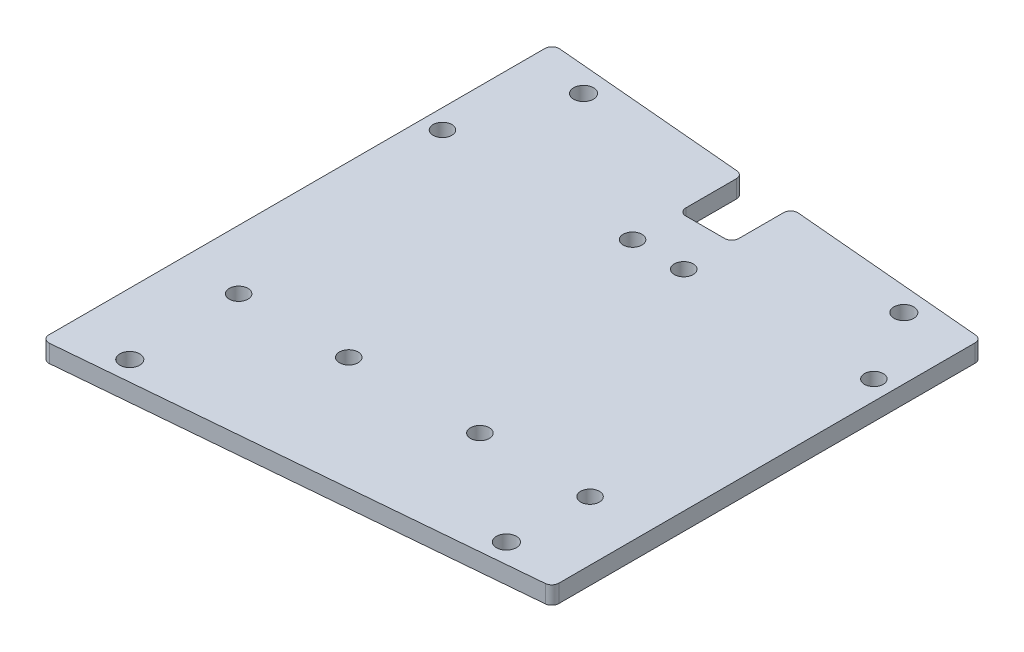
ISO-10303-21;
HEADER;
FILE_DESCRIPTION(('STEP AP214'),'2;1');
FILE_NAME('part.step','',(''),(''),'','','');
FILE_SCHEMA(('AUTOMOTIVE_DESIGN { 1 0 10303 214 1 1 1 1 }'));
ENDSEC;
DATA;
#1=APPLICATION_CONTEXT('core data for automotive mechanical design processes');
#2=APPLICATION_PROTOCOL_DEFINITION('international standard','automotive_design',2000,#1);
#3=PRODUCT_CONTEXT('',#1,'mechanical');
#4=PRODUCT('Part','Part','',(#3));
#5=PRODUCT_RELATED_PRODUCT_CATEGORY('part','',(#4));
#6=PRODUCT_DEFINITION_FORMATION('','',#4);
#7=PRODUCT_DEFINITION_CONTEXT('part definition',#1,'design');
#8=PRODUCT_DEFINITION('design','',#6,#7);
#9=PRODUCT_DEFINITION_SHAPE('','',#8);
#10=(LENGTH_UNIT() NAMED_UNIT(*) SI_UNIT(.MILLI.,.METRE.));
#11=(NAMED_UNIT(*) PLANE_ANGLE_UNIT() SI_UNIT($,.RADIAN.));
#12=(NAMED_UNIT(*) SI_UNIT($,.STERADIAN.) SOLID_ANGLE_UNIT());
#13=UNCERTAINTY_MEASURE_WITH_UNIT(LENGTH_MEASURE(1.E-05),#10,'distance_accuracy_value','');
#14=(GEOMETRIC_REPRESENTATION_CONTEXT(3) GLOBAL_UNCERTAINTY_ASSIGNED_CONTEXT((#13)) GLOBAL_UNIT_ASSIGNED_CONTEXT((#10,
#11,#12)) REPRESENTATION_CONTEXT('',''));
#15=CARTESIAN_POINT('',(0.,0.,0.));
#16=DIRECTION('',(0.,0.,1.));
#17=DIRECTION('',(1.,0.,0.));
#18=AXIS2_PLACEMENT_3D('',#15,#16,#17);
#19=CARTESIAN_POINT('',(0.,6.35,-76.835));
#20=DIRECTION('',(-0.0871557427476541,0.,0.996194698091746));
#21=DIRECTION('',(0.996194698091746,0.,0.0871557427476541));
#22=AXIS2_PLACEMENT_3D('',#19,#20,#21);
#23=PLANE('',#22);
#24=DIRECTION('',(-0.996194698091746,0.,-0.0871557427476541));
#25=VECTOR('',#24,1.);
#26=CARTESIAN_POINT('',(0.,6.35,-76.835));
#27=LINE('',#26,#25);
#28=CARTESIAN_POINT('',(-99.4736244134209,6.35,-85.5378144560095));
#29=VERTEX_POINT('',#28);
#30=CARTESIAN_POINT('',(-169.323624413421,6.35,-91.648897603295));
#31=VERTEX_POINT('',#30);
#32=EDGE_CURVE('E174',#29,#31,#27,.T.);
#33=ORIENTED_EDGE('',*,*,#32,.F.);
#34=DIRECTION('',(0.,-1.,0.));
#35=VECTOR('',#34,1.);
#36=CARTESIAN_POINT('',(-99.473624413421,6.35,-85.5378144560095));
#37=LINE('',#36,#35);
#38=CARTESIAN_POINT('',(-99.4736244134209,0.,-85.5378144560095));
#39=VERTEX_POINT('',#38);
#40=EDGE_CURVE('E158',#29,#39,#37,.T.);
#41=ORIENTED_EDGE('',*,*,#40,.T.);
#42=DIRECTION('',(-0.996194698091746,0.,-0.0871557427476541));
#43=VECTOR('',#42,1.);
#44=CARTESIAN_POINT('',(0.,0.,-76.835));
#45=LINE('',#44,#43);
#46=CARTESIAN_POINT('',(-169.323624413421,0.,-91.648897603295));
#47=VERTEX_POINT('',#46);
#48=EDGE_CURVE('E171',#39,#47,#45,.T.);
#49=ORIENTED_EDGE('',*,*,#48,.T.);
#50=DIRECTION('',(0.,1.,0.));
#51=VECTOR('',#50,1.);
#52=CARTESIAN_POINT('',(-169.323624413421,6.35,-91.648897603295));
#53=LINE('',#52,#51);
#54=EDGE_CURVE('E176',#47,#31,#53,.T.);
#55=ORIENTED_EDGE('',*,*,#54,.T.);
#56=EDGE_LOOP('',(#33,#41,#49,#55));
#57=FACE_BOUND('',#56,.T.);
#58=ADVANCED_FACE('F41',(#57),#23,.F.);
#59=CARTESIAN_POINT('',(-5.49362441342097,0.,-77.3156298578436));
#60=VERTEX_POINT('',#59);
#61=CARTESIAN_POINT('',(-75.343624413421,0.,-83.4267130051291));
#62=VERTEX_POINT('',#61);
#63=EDGE_CURVE('E181',#60,#62,#45,.T.);
#64=ORIENTED_EDGE('',*,*,#63,.T.);
#65=DIRECTION('',(0.,1.,0.));
#66=VECTOR('',#65,1.);
#67=CARTESIAN_POINT('',(-75.343624413421,6.35,-83.4267130051291));
#68=LINE('',#67,#66);
#69=CARTESIAN_POINT('',(-75.343624413421,6.35,-83.4267130051291));
#70=VERTEX_POINT('',#69);
#71=EDGE_CURVE('E224',#62,#70,#68,.T.);
#72=ORIENTED_EDGE('',*,*,#71,.T.);
#73=CARTESIAN_POINT('',(-5.49362441342097,6.35,-77.3156298578436));
#74=VERTEX_POINT('',#73);
#75=EDGE_CURVE('E278',#74,#70,#27,.T.);
#76=ORIENTED_EDGE('',*,*,#75,.F.);
#77=DIRECTION('',(0.,1.,0.));
#78=VECTOR('',#77,1.);
#79=CARTESIAN_POINT('',(-5.49362441342097,6.35,-77.3156298578436));
#80=LINE('',#79,#78);
#81=EDGE_CURVE('E222',#74,#60,#80,.F.);
#82=ORIENTED_EDGE('',*,*,#81,.T.);
#83=EDGE_LOOP('',(#64,#72,#76,#82));
#84=FACE_BOUND('',#83,.T.);
#85=ADVANCED_FACE('F303',(#84),#23,.F.);
#86=CARTESIAN_POINT('',(0.,6.35,76.835));
#87=DIRECTION('',(-0.0871557427476544,0.,-0.996194698091746));
#88=DIRECTION('',(-0.996194698091746,0.,0.0871557427476544));
#89=AXIS2_PLACEMENT_3D('',#86,#87,#88);
#90=PLANE('',#89);
#91=DIRECTION('',(0.996194698091746,0.,-0.0871557427476544));
#92=VECTOR('',#91,1.);
#93=CARTESIAN_POINT('',(0.,0.,76.835));
#94=LINE('',#93,#92);
#95=CARTESIAN_POINT('',(-169.323624413421,0.,91.6488976032951));
#96=VERTEX_POINT('',#95);
#97=CARTESIAN_POINT('',(-5.49362441342094,0.,77.3156298578436));
#98=VERTEX_POINT('',#97);
#99=EDGE_CURVE('E185',#96,#98,#94,.T.);
#100=ORIENTED_EDGE('',*,*,#99,.T.);
#101=DIRECTION('',(0.,1.,0.));
#102=VECTOR('',#101,1.);
#103=CARTESIAN_POINT('',(-5.49362441342094,6.35,77.3156298578436));
#104=LINE('',#103,#102);
#105=CARTESIAN_POINT('',(-5.49362441342094,6.35,77.3156298578436));
#106=VERTEX_POINT('',#105);
#107=EDGE_CURVE('E244',#98,#106,#104,.T.);
#108=ORIENTED_EDGE('',*,*,#107,.T.);
#109=DIRECTION('',(0.996194698091746,0.,-0.0871557427476544));
#110=VECTOR('',#109,1.);
#111=CARTESIAN_POINT('',(0.,6.35,76.835));
#112=LINE('',#111,#110);
#113=CARTESIAN_POINT('',(-169.323624413421,6.35,91.6488976032951));
#114=VERTEX_POINT('',#113);
#115=EDGE_CURVE('E191',#114,#106,#112,.T.);
#116=ORIENTED_EDGE('',*,*,#115,.F.);
#117=DIRECTION('',(0.,-1.,0.));
#118=VECTOR('',#117,1.);
#119=CARTESIAN_POINT('',(-169.323624413421,6.35,91.6488976032951));
#120=LINE('',#119,#118);
#121=EDGE_CURVE('E241',#114,#96,#120,.T.);
#122=ORIENTED_EDGE('',*,*,#121,.T.);
#123=EDGE_LOOP('',(#100,#108,#116,#122));
#124=FACE_BOUND('',#123,.T.);
#125=ADVANCED_FACE('F309',(#124),#90,.F.);
#126=CARTESIAN_POINT('',(0.,6.35,0.));
#127=DIRECTION('',(0.,1.,0.));
#128=DIRECTION('',(0.,0.,1.));
#129=AXIS2_PLACEMENT_3D('',#126,#127,#128);
#130=PLANE('',#129);
#131=DIRECTION('',(0.,0.,1.));
#132=VECTOR('',#131,1.);
#133=CARTESIAN_POINT('',(-97.155,6.35,-62.2766315847764));
#134=LINE('',#133,#132);
#135=CARTESIAN_POINT('',(-97.155,6.35,-83.0074799228565));
#136=VERTEX_POINT('',#135);
#137=CARTESIAN_POINT('',(-97.155,6.35,-64.8166315847764));
#138=VERTEX_POINT('',#137);
#139=EDGE_CURVE('E257',#136,#138,#134,.T.);
#140=ORIENTED_EDGE('',*,*,#139,.F.);
#141=CARTESIAN_POINT('',(-99.695,6.35,-83.0074799228565));
#142=DIRECTION('',(0.,1.,0.));
#143=DIRECTION('',(0.,0.,1.));
#144=AXIS2_PLACEMENT_3D('',#141,#142,#143);
#145=CIRCLE('',#144,2.54);
#146=EDGE_CURVE('E220',#136,#29,#145,.T.);
#147=ORIENTED_EDGE('',*,*,#146,.T.);
#148=ORIENTED_EDGE('',*,*,#32,.T.);
#149=CARTESIAN_POINT('',(-169.545,6.35,-89.118563070142));
#150=DIRECTION('',(0.,1.,0.));
#151=DIRECTION('',(0.,0.,1.));
#152=AXIS2_PLACEMENT_3D('',#149,#150,#151);
#153=CIRCLE('',#152,2.54);
#154=CARTESIAN_POINT('',(-172.085,6.35,-89.118563070142));
#155=VERTEX_POINT('',#154);
#156=EDGE_CURVE('E210',#31,#155,#153,.T.);
#157=ORIENTED_EDGE('',*,*,#156,.T.);
#158=DIRECTION('',(0.,0.,-1.));
#159=VECTOR('',#158,1.);
#160=CARTESIAN_POINT('',(-172.085,6.35,-92.1682631695527));
#161=LINE('',#160,#159);
#162=CARTESIAN_POINT('',(-172.085,6.35,89.1185630701421));
#163=VERTEX_POINT('',#162);
#164=EDGE_CURVE('E284',#163,#155,#161,.T.);
#165=ORIENTED_EDGE('',*,*,#164,.F.);
#166=CARTESIAN_POINT('',(-169.545,6.35,89.118563070142));
#167=DIRECTION('',(0.,1.,0.));
#168=DIRECTION('',(0.,0.,1.));
#169=AXIS2_PLACEMENT_3D('',#166,#167,#168);
#170=CIRCLE('',#169,2.54);
#171=EDGE_CURVE('E212',#163,#114,#170,.T.);
#172=ORIENTED_EDGE('',*,*,#171,.T.);
#173=ORIENTED_EDGE('',*,*,#115,.T.);
#174=CARTESIAN_POINT('',(-5.71499999999998,6.35,74.7852953246905));
#175=DIRECTION('',(0.,1.,0.));
#176=DIRECTION('',(0.,0.,1.));
#177=AXIS2_PLACEMENT_3D('',#174,#175,#176);
#178=CIRCLE('',#177,2.54);
#179=CARTESIAN_POINT('',(-3.17499999999998,6.35,74.7852953246905));
#180=VERTEX_POINT('',#179);
#181=EDGE_CURVE('E214',#106,#180,#178,.T.);
#182=ORIENTED_EDGE('',*,*,#181,.T.);
#183=DIRECTION('',(0.,0.,1.));
#184=VECTOR('',#183,1.);
#185=CARTESIAN_POINT('',(-3.17500000000001,6.35,-77.1127765066948));
#186=LINE('',#185,#184);
#187=CARTESIAN_POINT('',(-3.17500000000001,6.35,-74.7852953246905));
#188=VERTEX_POINT('',#187);
#189=EDGE_CURVE('E345',#188,#180,#186,.T.);
#190=ORIENTED_EDGE('',*,*,#189,.F.);
#191=CARTESIAN_POINT('',(-5.71500000000001,6.35,-74.7852953246905));
#192=DIRECTION('',(0.,1.,0.));
#193=DIRECTION('',(0.,0.,1.));
#194=AXIS2_PLACEMENT_3D('',#191,#192,#193);
#195=CIRCLE('',#194,2.54);
#196=EDGE_CURVE('E216',#188,#74,#195,.T.);
#197=ORIENTED_EDGE('',*,*,#196,.T.);
#198=ORIENTED_EDGE('',*,*,#75,.T.);
#199=CARTESIAN_POINT('',(-75.565,6.35,-80.896378471976));
#200=DIRECTION('',(0.,1.,0.));
#201=DIRECTION('',(0.,0.,1.));
#202=AXIS2_PLACEMENT_3D('',#199,#200,#201);
#203=CIRCLE('',#202,2.54);
#204=CARTESIAN_POINT('',(-78.105,6.35,-80.896378471976));
#205=VERTEX_POINT('',#204);
#206=EDGE_CURVE('E218',#70,#205,#203,.T.);
#207=ORIENTED_EDGE('',*,*,#206,.T.);
#208=DIRECTION('',(0.,0.,-1.));
#209=VECTOR('',#208,1.);
#210=CARTESIAN_POINT('',(-78.105,6.35,-62.2766315847764));
#211=LINE('',#210,#209);
#212=CARTESIAN_POINT('',(-78.105,6.35,-64.8166315847764));
#213=VERTEX_POINT('',#212);
#214=EDGE_CURVE('E271',#213,#205,#211,.T.);
#215=ORIENTED_EDGE('',*,*,#214,.F.);
#216=CARTESIAN_POINT('',(-80.645,6.35,-64.8166315847764));
#217=DIRECTION('',(0.,1.,0.));
#218=DIRECTION('',(0.,0.,1.));
#219=AXIS2_PLACEMENT_3D('',#216,#217,#218);
#220=CIRCLE('',#219,2.54);
#221=CARTESIAN_POINT('',(-80.645,6.35,-62.2766315847764));
#222=VERTEX_POINT('',#221);
#223=EDGE_CURVE('E56',#213,#222,#220,.F.);
#224=ORIENTED_EDGE('',*,*,#223,.T.);
#225=DIRECTION('',(1.,0.,0.));
#226=VECTOR('',#225,1.);
#227=CARTESIAN_POINT('',(-78.105,6.35,-62.2766315847764));
#228=LINE('',#227,#226);
#229=CARTESIAN_POINT('',(-94.615,6.35,-62.2766315847764));
#230=VERTEX_POINT('',#229);
#231=EDGE_CURVE('E258',#230,#222,#228,.T.);
#232=ORIENTED_EDGE('',*,*,#231,.F.);
#233=CARTESIAN_POINT('',(-94.615,6.35,-64.8166315847764));
#234=DIRECTION('',(0.,1.,0.));
#235=DIRECTION('',(0.,0.,1.));
#236=AXIS2_PLACEMENT_3D('',#233,#234,#235);
#237=CIRCLE('',#236,2.54);
#238=EDGE_CURVE('E49',#230,#138,#237,.F.);
#239=ORIENTED_EDGE('',*,*,#238,.T.);
#240=EDGE_LOOP('',(#140,#147,#148,#157,#165,#172,#173,#182,#190,#197,#198,#207,#215,#224,#232,#239));
#241=FACE_BOUND('',#240,.T.);
#242=CARTESIAN_POINT('',(-25.3999999999999,6.35,-71.4003706478002));
#243=DIRECTION('',(0.,1.,0.));
#244=DIRECTION('',(0.,0.,1.));
#245=AXIS2_PLACEMENT_3D('',#242,#243,#244);
#246=CIRCLE('',#245,3.57124);
#247=CARTESIAN_POINT('',(-25.3999999999999,6.35,-67.8291306478002));
#248=VERTEX_POINT('',#247);
#249=EDGE_CURVE('E292',#248,#248,#246,.T.);
#250=ORIENTED_EDGE('',*,*,#249,.F.);
#251=EDGE_LOOP('',(#250));
#252=FACE_BOUND('',#251,.T.);
#253=CARTESIAN_POINT('',(-25.3999999999999,6.35,71.4003706478001));
#254=DIRECTION('',(0.,1.,0.));
#255=DIRECTION('',(0.,0.,1.));
#256=AXIS2_PLACEMENT_3D('',#253,#254,#255);
#257=CIRCLE('',#256,3.57124);
#258=CARTESIAN_POINT('',(-25.3999999999999,6.35,74.9716106478001));
#259=VERTEX_POINT('',#258);
#260=EDGE_CURVE('E357',#259,#259,#257,.T.);
#261=ORIENTED_EDGE('',*,*,#260,.F.);
#262=EDGE_LOOP('',(#261));
#263=FACE_BOUND('',#262,.T.);
#264=CARTESIAN_POINT('',(-149.86,6.35,82.2892097102357));
#265=DIRECTION('',(0.,1.,0.));
#266=DIRECTION('',(0.,0.,1.));
#267=AXIS2_PLACEMENT_3D('',#264,#265,#266);
#268=CIRCLE('',#267,3.57124);
#269=CARTESIAN_POINT('',(-149.86,6.35,85.8604497102357));
#270=VERTEX_POINT('',#269);
#271=EDGE_CURVE('E363',#270,#270,#268,.T.);
#272=ORIENTED_EDGE('',*,*,#271,.F.);
#273=EDGE_LOOP('',(#272));
#274=FACE_BOUND('',#273,.T.);
#275=CARTESIAN_POINT('',(-151.13,6.35,-82.0419999999999));
#276=DIRECTION('',(0.,1.,0.));
#277=DIRECTION('',(0.,0.,1.));
#278=AXIS2_PLACEMENT_3D('',#275,#276,#277);
#279=CIRCLE('',#278,3.57124);
#280=CARTESIAN_POINT('',(-151.13,6.35,-78.4707599999999));
#281=VERTEX_POINT('',#280);
#282=EDGE_CURVE('E369',#281,#281,#279,.T.);
#283=ORIENTED_EDGE('',*,*,#282,.F.);
#284=EDGE_LOOP('',(#283));
#285=FACE_BOUND('',#284,.T.);
#286=CARTESIAN_POINT('',(-24.4850000000002,6.35,42.2700000000001));
#287=DIRECTION('',(0.,1.,0.));
#288=DIRECTION('',(0.,0.,1.));
#289=AXIS2_PLACEMENT_3D('',#286,#287,#288);
#290=CIRCLE('',#289,3.373501);
#291=CARTESIAN_POINT('',(-24.4850000000002,6.35,45.6435010000001));
#292=VERTEX_POINT('',#291);
#293=EDGE_CURVE('E375',#292,#292,#290,.T.);
#294=ORIENTED_EDGE('',*,*,#293,.F.);
#295=EDGE_LOOP('',(#294));
#296=FACE_BOUND('',#295,.T.);
#297=CARTESIAN_POINT('',(-64.0721000000002,6.35,42.2700000000001));
#298=DIRECTION('',(0.,1.,0.));
#299=DIRECTION('',(0.,0.,1.));
#300=AXIS2_PLACEMENT_3D('',#297,#298,#299);
#301=CIRCLE('',#300,3.373501);
#302=CARTESIAN_POINT('',(-64.0721000000002,6.35,45.6435010000001));
#303=VERTEX_POINT('',#302);
#304=EDGE_CURVE('E381',#303,#303,#301,.T.);
#305=ORIENTED_EDGE('',*,*,#304,.F.);
#306=EDGE_LOOP('',(#305));
#307=FACE_BOUND('',#306,.T.);
#308=CARTESIAN_POINT('',(-111.1879,6.35,42.2700000000001));
#309=DIRECTION('',(0.,1.,0.));
#310=DIRECTION('',(0.,0.,1.));
#311=AXIS2_PLACEMENT_3D('',#308,#309,#310);
#312=CIRCLE('',#311,3.373501);
#313=CARTESIAN_POINT('',(-111.1879,6.35,45.6435010000001));
#314=VERTEX_POINT('',#313);
#315=EDGE_CURVE('E387',#314,#314,#312,.T.);
#316=ORIENTED_EDGE('',*,*,#315,.F.);
#317=EDGE_LOOP('',(#316));
#318=FACE_BOUND('',#317,.T.);
#319=CARTESIAN_POINT('',(-150.775,6.35,42.2700000000001));
#320=DIRECTION('',(0.,1.,0.));
#321=DIRECTION('',(0.,0.,1.));
#322=AXIS2_PLACEMENT_3D('',#319,#320,#321);
#323=CIRCLE('',#322,3.373501);
#324=CARTESIAN_POINT('',(-150.775,6.35,45.6435010000001));
#325=VERTEX_POINT('',#324);
#326=EDGE_CURVE('E393',#325,#325,#323,.T.);
#327=ORIENTED_EDGE('',*,*,#326,.F.);
#328=EDGE_LOOP('',(#327));
#329=FACE_BOUND('',#328,.T.);
#330=CARTESIAN_POINT('',(-78.4321000000002,6.35,-45.3549999999999));
#331=DIRECTION('',(0.,1.,0.));
#332=DIRECTION('',(0.,0.,1.));
#333=AXIS2_PLACEMENT_3D('',#330,#331,#332);
#334=CIRCLE('',#333,3.373501);
#335=CARTESIAN_POINT('',(-78.4321000000002,6.35,-41.9814989999999));
#336=VERTEX_POINT('',#335);
#337=EDGE_CURVE('E399',#336,#336,#334,.T.);
#338=ORIENTED_EDGE('',*,*,#337,.F.);
#339=EDGE_LOOP('',(#338));
#340=FACE_BOUND('',#339,.T.);
#341=CARTESIAN_POINT('',(-10.1250000000002,6.35,-45.3549999999999));
#342=DIRECTION('',(0.,1.,0.));
#343=DIRECTION('',(0.,0.,1.));
#344=AXIS2_PLACEMENT_3D('',#341,#342,#343);
#345=CIRCLE('',#344,3.373501);
#346=CARTESIAN_POINT('',(-10.1250000000002,6.35,-41.9814989999999));
#347=VERTEX_POINT('',#346);
#348=EDGE_CURVE('E405',#347,#347,#345,.T.);
#349=ORIENTED_EDGE('',*,*,#348,.F.);
#350=EDGE_LOOP('',(#349));
#351=FACE_BOUND('',#350,.T.);
#352=CARTESIAN_POINT('',(-96.8279000000002,6.35,-45.3549999999999));
#353=DIRECTION('',(0.,1.,0.));
#354=DIRECTION('',(0.,0.,1.));
#355=AXIS2_PLACEMENT_3D('',#352,#353,#354);
#356=CIRCLE('',#355,3.373501);
#357=CARTESIAN_POINT('',(-96.8279000000002,6.35,-41.9814989999999));
#358=VERTEX_POINT('',#357);
#359=EDGE_CURVE('E411',#358,#358,#356,.T.);
#360=ORIENTED_EDGE('',*,*,#359,.F.);
#361=EDGE_LOOP('',(#360));
#362=FACE_BOUND('',#361,.T.);
#363=CARTESIAN_POINT('',(-165.135,6.35,-45.3549999999999));
#364=DIRECTION('',(0.,1.,0.));
#365=DIRECTION('',(0.,0.,1.));
#366=AXIS2_PLACEMENT_3D('',#363,#364,#365);
#367=CIRCLE('',#366,3.373501);
#368=CARTESIAN_POINT('',(-165.135,6.35,-41.9814989999999));
#369=VERTEX_POINT('',#368);
#370=EDGE_CURVE('E416',#369,#369,#367,.T.);
#371=ORIENTED_EDGE('',*,*,#370,.F.);
#372=EDGE_LOOP('',(#371));
#373=FACE_BOUND('',#372,.T.);
#374=ADVANCED_FACE('F255',(#241,#252,#263,#274,#285,#296,#307,#318,#329,#340,#351,#362,#373),
#130,.T.);
#375=CARTESIAN_POINT('',(0.,0.,0.));
#376=DIRECTION('',(0.,1.,0.));
#377=DIRECTION('',(0.,0.,1.));
#378=AXIS2_PLACEMENT_3D('',#375,#376,#377);
#379=PLANE('',#378);
#380=CARTESIAN_POINT('',(-25.3999999999999,0.,-71.4003706478002));
#381=DIRECTION('',(0.,1.,0.));
#382=DIRECTION('',(0.,0.,1.));
#383=AXIS2_PLACEMENT_3D('',#380,#381,#382);
#384=CIRCLE('',#383,3.57124);
#385=CARTESIAN_POINT('',(-25.3999999999999,0.,-67.8291306478002));
#386=VERTEX_POINT('',#385);
#387=EDGE_CURVE('E354',#386,#386,#384,.T.);
#388=ORIENTED_EDGE('',*,*,#387,.T.);
#389=EDGE_LOOP('',(#388));
#390=FACE_BOUND('',#389,.T.);
#391=CARTESIAN_POINT('',(-25.3999999999999,0.,71.4003706478001));
#392=DIRECTION('',(0.,1.,0.));
#393=DIRECTION('',(0.,0.,1.));
#394=AXIS2_PLACEMENT_3D('',#391,#392,#393);
#395=CIRCLE('',#394,3.57124);
#396=CARTESIAN_POINT('',(-25.3999999999999,0.,74.9716106478001));
#397=VERTEX_POINT('',#396);
#398=EDGE_CURVE('E360',#397,#397,#395,.T.);
#399=ORIENTED_EDGE('',*,*,#398,.T.);
#400=EDGE_LOOP('',(#399));
#401=FACE_BOUND('',#400,.T.);
#402=CARTESIAN_POINT('',(-149.86,0.,82.2892097102357));
#403=DIRECTION('',(0.,1.,0.));
#404=DIRECTION('',(0.,0.,1.));
#405=AXIS2_PLACEMENT_3D('',#402,#403,#404);
#406=CIRCLE('',#405,3.57124);
#407=CARTESIAN_POINT('',(-149.86,0.,85.8604497102357));
#408=VERTEX_POINT('',#407);
#409=EDGE_CURVE('E366',#408,#408,#406,.T.);
#410=ORIENTED_EDGE('',*,*,#409,.T.);
#411=EDGE_LOOP('',(#410));
#412=FACE_BOUND('',#411,.T.);
#413=CARTESIAN_POINT('',(-151.13,0.,-82.0419999999999));
#414=DIRECTION('',(0.,1.,0.));
#415=DIRECTION('',(0.,0.,1.));
#416=AXIS2_PLACEMENT_3D('',#413,#414,#415);
#417=CIRCLE('',#416,3.57124);
#418=CARTESIAN_POINT('',(-151.13,0.,-78.4707599999999));
#419=VERTEX_POINT('',#418);
#420=EDGE_CURVE('E372',#419,#419,#417,.T.);
#421=ORIENTED_EDGE('',*,*,#420,.T.);
#422=EDGE_LOOP('',(#421));
#423=FACE_BOUND('',#422,.T.);
#424=CARTESIAN_POINT('',(-24.4850000000002,0.,42.2700000000001));
#425=DIRECTION('',(0.,1.,0.));
#426=DIRECTION('',(0.,0.,1.));
#427=AXIS2_PLACEMENT_3D('',#424,#425,#426);
#428=CIRCLE('',#427,3.373501);
#429=CARTESIAN_POINT('',(-24.4850000000002,0.,45.6435010000001));
#430=VERTEX_POINT('',#429);
#431=EDGE_CURVE('E378',#430,#430,#428,.T.);
#432=ORIENTED_EDGE('',*,*,#431,.T.);
#433=EDGE_LOOP('',(#432));
#434=FACE_BOUND('',#433,.T.);
#435=CARTESIAN_POINT('',(-64.0721000000002,0.,42.2700000000001));
#436=DIRECTION('',(0.,1.,0.));
#437=DIRECTION('',(0.,0.,1.));
#438=AXIS2_PLACEMENT_3D('',#435,#436,#437);
#439=CIRCLE('',#438,3.373501);
#440=CARTESIAN_POINT('',(-64.0721000000002,0.,45.6435010000001));
#441=VERTEX_POINT('',#440);
#442=EDGE_CURVE('E384',#441,#441,#439,.T.);
#443=ORIENTED_EDGE('',*,*,#442,.T.);
#444=EDGE_LOOP('',(#443));
#445=FACE_BOUND('',#444,.T.);
#446=CARTESIAN_POINT('',(-111.1879,0.,42.2700000000001));
#447=DIRECTION('',(0.,1.,0.));
#448=DIRECTION('',(0.,0.,1.));
#449=AXIS2_PLACEMENT_3D('',#446,#447,#448);
#450=CIRCLE('',#449,3.373501);
#451=CARTESIAN_POINT('',(-111.1879,0.,45.6435010000001));
#452=VERTEX_POINT('',#451);
#453=EDGE_CURVE('E390',#452,#452,#450,.T.);
#454=ORIENTED_EDGE('',*,*,#453,.T.);
#455=EDGE_LOOP('',(#454));
#456=FACE_BOUND('',#455,.T.);
#457=CARTESIAN_POINT('',(-150.775,0.,42.2700000000001));
#458=DIRECTION('',(0.,1.,0.));
#459=DIRECTION('',(0.,0.,1.));
#460=AXIS2_PLACEMENT_3D('',#457,#458,#459);
#461=CIRCLE('',#460,3.373501);
#462=CARTESIAN_POINT('',(-150.775,0.,45.6435010000001));
#463=VERTEX_POINT('',#462);
#464=EDGE_CURVE('E396',#463,#463,#461,.T.);
#465=ORIENTED_EDGE('',*,*,#464,.T.);
#466=EDGE_LOOP('',(#465));
#467=FACE_BOUND('',#466,.T.);
#468=CARTESIAN_POINT('',(-78.4321000000002,0.,-45.3549999999999));
#469=DIRECTION('',(0.,1.,0.));
#470=DIRECTION('',(0.,0.,1.));
#471=AXIS2_PLACEMENT_3D('',#468,#469,#470);
#472=CIRCLE('',#471,3.373501);
#473=CARTESIAN_POINT('',(-78.4321000000002,0.,-41.9814989999999));
#474=VERTEX_POINT('',#473);
#475=EDGE_CURVE('E402',#474,#474,#472,.T.);
#476=ORIENTED_EDGE('',*,*,#475,.T.);
#477=EDGE_LOOP('',(#476));
#478=FACE_BOUND('',#477,.T.);
#479=CARTESIAN_POINT('',(-10.1250000000002,0.,-45.3549999999999));
#480=DIRECTION('',(0.,1.,0.));
#481=DIRECTION('',(0.,0.,1.));
#482=AXIS2_PLACEMENT_3D('',#479,#480,#481);
#483=CIRCLE('',#482,3.373501);
#484=CARTESIAN_POINT('',(-10.1250000000002,0.,-41.9814989999999));
#485=VERTEX_POINT('',#484);
#486=EDGE_CURVE('E408',#485,#485,#483,.T.);
#487=ORIENTED_EDGE('',*,*,#486,.T.);
#488=EDGE_LOOP('',(#487));
#489=FACE_BOUND('',#488,.T.);
#490=CARTESIAN_POINT('',(-96.8279000000002,0.,-45.3549999999999));
#491=DIRECTION('',(0.,1.,0.));
#492=DIRECTION('',(0.,0.,1.));
#493=AXIS2_PLACEMENT_3D('',#490,#491,#492);
#494=CIRCLE('',#493,3.373501);
#495=CARTESIAN_POINT('',(-96.8279000000002,0.,-41.9814989999999));
#496=VERTEX_POINT('',#495);
#497=EDGE_CURVE('E414',#496,#496,#494,.T.);
#498=ORIENTED_EDGE('',*,*,#497,.T.);
#499=EDGE_LOOP('',(#498));
#500=FACE_BOUND('',#499,.T.);
#501=CARTESIAN_POINT('',(-165.135,0.,-45.3549999999999));
#502=DIRECTION('',(0.,1.,0.));
#503=DIRECTION('',(0.,0.,1.));
#504=AXIS2_PLACEMENT_3D('',#501,#502,#503);
#505=CIRCLE('',#504,3.373501);
#506=CARTESIAN_POINT('',(-165.135,0.,-41.9814989999999));
#507=VERTEX_POINT('',#506);
#508=EDGE_CURVE('E261',#507,#507,#505,.T.);
#509=ORIENTED_EDGE('',*,*,#508,.T.);
#510=EDGE_LOOP('',(#509));
#511=FACE_BOUND('',#510,.T.);
#512=ORIENTED_EDGE('',*,*,#48,.F.);
#513=CARTESIAN_POINT('',(-99.695,0.,-83.0074799228565));
#514=DIRECTION('',(0.,1.,0.));
#515=DIRECTION('',(0.,0.,1.));
#516=AXIS2_PLACEMENT_3D('',#513,#514,#515);
#517=CIRCLE('',#516,2.54);
#518=CARTESIAN_POINT('',(-97.155,0.,-83.0074799228565));
#519=VERTEX_POINT('',#518);
#520=EDGE_CURVE('E154',#39,#519,#517,.F.);
#521=ORIENTED_EDGE('',*,*,#520,.T.);
#522=DIRECTION('',(0.,0.,1.));
#523=VECTOR('',#522,1.);
#524=CARTESIAN_POINT('',(-97.155,0.,0.));
#525=LINE('',#524,#523);
#526=CARTESIAN_POINT('',(-97.155,0.,-64.8166315847764));
#527=VERTEX_POINT('',#526);
#528=EDGE_CURVE('E195',#519,#527,#525,.T.);
#529=ORIENTED_EDGE('',*,*,#528,.T.);
#530=CARTESIAN_POINT('',(-94.615,0.,-64.8166315847764));
#531=DIRECTION('',(0.,1.,0.));
#532=DIRECTION('',(0.,0.,1.));
#533=AXIS2_PLACEMENT_3D('',#530,#531,#532);
#534=CIRCLE('',#533,2.54);
#535=CARTESIAN_POINT('',(-94.615,0.,-62.2766315847764));
#536=VERTEX_POINT('',#535);
#537=EDGE_CURVE('E11',#527,#536,#534,.T.);
#538=ORIENTED_EDGE('',*,*,#537,.T.);
#539=DIRECTION('',(1.,0.,0.));
#540=VECTOR('',#539,1.);
#541=CARTESIAN_POINT('',(-78.105,0.,-62.2766315847764));
#542=LINE('',#541,#540);
#543=CARTESIAN_POINT('',(-80.645,0.,-62.2766315847764));
#544=VERTEX_POINT('',#543);
#545=EDGE_CURVE('E187',#536,#544,#542,.T.);
#546=ORIENTED_EDGE('',*,*,#545,.T.);
#547=CARTESIAN_POINT('',(-80.645,0.,-64.8166315847764));
#548=DIRECTION('',(0.,1.,0.));
#549=DIRECTION('',(0.,0.,1.));
#550=AXIS2_PLACEMENT_3D('',#547,#548,#549);
#551=CIRCLE('',#550,2.54);
#552=CARTESIAN_POINT('',(-78.105,0.,-64.8166315847764));
#553=VERTEX_POINT('',#552);
#554=EDGE_CURVE('E252',#544,#553,#551,.T.);
#555=ORIENTED_EDGE('',*,*,#554,.T.);
#556=DIRECTION('',(0.,0.,-1.));
#557=VECTOR('',#556,1.);
#558=CARTESIAN_POINT('',(-78.105,0.,-62.2766315847764));
#559=LINE('',#558,#557);
#560=CARTESIAN_POINT('',(-78.105,0.,-80.896378471976));
#561=VERTEX_POINT('',#560);
#562=EDGE_CURVE('E182',#553,#561,#559,.T.);
#563=ORIENTED_EDGE('',*,*,#562,.T.);
#564=CARTESIAN_POINT('',(-75.565,0.,-80.896378471976));
#565=DIRECTION('',(0.,1.,0.));
#566=DIRECTION('',(0.,0.,1.));
#567=AXIS2_PLACEMENT_3D('',#564,#565,#566);
#568=CIRCLE('',#567,2.54);
#569=EDGE_CURVE('E165',#561,#62,#568,.F.);
#570=ORIENTED_EDGE('',*,*,#569,.T.);
#571=ORIENTED_EDGE('',*,*,#63,.F.);
#572=CARTESIAN_POINT('',(-5.71500000000001,0.,-74.7852953246905));
#573=DIRECTION('',(0.,1.,0.));
#574=DIRECTION('',(0.,0.,1.));
#575=AXIS2_PLACEMENT_3D('',#572,#573,#574);
#576=CIRCLE('',#575,2.54);
#577=CARTESIAN_POINT('',(-3.17500000000001,0.,-74.7852953246905));
#578=VERTEX_POINT('',#577);
#579=EDGE_CURVE('E205',#60,#578,#576,.F.);
#580=ORIENTED_EDGE('',*,*,#579,.T.);
#581=DIRECTION('',(0.,0.,1.));
#582=VECTOR('',#581,1.);
#583=CARTESIAN_POINT('',(-3.17500000000001,0.,-77.1127765066948));
#584=LINE('',#583,#582);
#585=CARTESIAN_POINT('',(-3.17499999999998,0.,74.7852953246905));
#586=VERTEX_POINT('',#585);
#587=EDGE_CURVE('E293',#578,#586,#584,.T.);
#588=ORIENTED_EDGE('',*,*,#587,.T.);
#589=CARTESIAN_POINT('',(-5.71499999999998,0.,74.7852953246905));
#590=DIRECTION('',(0.,1.,0.));
#591=DIRECTION('',(0.,0.,1.));
#592=AXIS2_PLACEMENT_3D('',#589,#590,#591);
#593=CIRCLE('',#592,2.54);
#594=EDGE_CURVE('E203',#586,#98,#593,.F.);
#595=ORIENTED_EDGE('',*,*,#594,.T.);
#596=ORIENTED_EDGE('',*,*,#99,.F.);
#597=CARTESIAN_POINT('',(-169.545,0.,89.118563070142));
#598=DIRECTION('',(0.,1.,0.));
#599=DIRECTION('',(0.,0.,1.));
#600=AXIS2_PLACEMENT_3D('',#597,#598,#599);
#601=CIRCLE('',#600,2.54);
#602=CARTESIAN_POINT('',(-172.085,0.,89.118563070142));
#603=VERTEX_POINT('',#602);
#604=EDGE_CURVE('E201',#96,#603,#601,.F.);
#605=ORIENTED_EDGE('',*,*,#604,.T.);
#606=DIRECTION('',(0.,0.,-1.));
#607=VECTOR('',#606,1.);
#608=CARTESIAN_POINT('',(-172.085,0.,0.));
#609=LINE('',#608,#607);
#610=CARTESIAN_POINT('',(-172.085,0.,-89.118563070142));
#611=VERTEX_POINT('',#610);
#612=EDGE_CURVE('E197',#603,#611,#609,.T.);
#613=ORIENTED_EDGE('',*,*,#612,.T.);
#614=CARTESIAN_POINT('',(-169.545,0.,-89.118563070142));
#615=DIRECTION('',(0.,1.,0.));
#616=DIRECTION('',(0.,0.,1.));
#617=AXIS2_PLACEMENT_3D('',#614,#615,#616);
#618=CIRCLE('',#617,2.54);
#619=EDGE_CURVE('E175',#611,#47,#618,.F.);
#620=ORIENTED_EDGE('',*,*,#619,.T.);
#621=EDGE_LOOP('',(#512,#521,#529,#538,#546,#555,#563,#570,#571,#580,#588,#595,#596,#605,#613,#620));
#622=FACE_BOUND('',#621,.T.);
#623=ADVANCED_FACE('F178',(#390,#401,#412,#423,#434,#445,#456,#467,#478,#489,#500,#511,#622),
#379,.F.);
#624=CARTESIAN_POINT('',(-97.155,0.,-62.2766315847764));
#625=DIRECTION('',(-1.,0.,0.));
#626=DIRECTION('',(0.,0.,1.));
#627=AXIS2_PLACEMENT_3D('',#624,#625,#626);
#628=PLANE('',#627);
#629=ORIENTED_EDGE('',*,*,#528,.F.);
#630=DIRECTION('',(0.,-1.,0.));
#631=VECTOR('',#630,1.);
#632=CARTESIAN_POINT('',(-97.155,0.,-83.0074799228565));
#633=LINE('',#632,#631);
#634=EDGE_CURVE('E159',#519,#136,#633,.F.);
#635=ORIENTED_EDGE('',*,*,#634,.T.);
#636=ORIENTED_EDGE('',*,*,#139,.T.);
#637=DIRECTION('',(0.,1.,0.));
#638=VECTOR('',#637,1.);
#639=CARTESIAN_POINT('',(-97.155,0.,-64.8166315847764));
#640=LINE('',#639,#638);
#641=EDGE_CURVE('E164',#138,#527,#640,.F.);
#642=ORIENTED_EDGE('',*,*,#641,.T.);
#643=EDGE_LOOP('',(#629,#635,#636,#642));
#644=FACE_BOUND('',#643,.T.);
#645=ADVANCED_FACE('F260',(#644),#628,.F.);
#646=CARTESIAN_POINT('',(-78.105,0.,-62.2766315847764));
#647=DIRECTION('',(1.,0.,0.));
#648=DIRECTION('',(0.,0.,-1.));
#649=AXIS2_PLACEMENT_3D('',#646,#647,#648);
#650=PLANE('',#649);
#651=ORIENTED_EDGE('',*,*,#214,.T.);
#652=DIRECTION('',(0.,1.,0.));
#653=VECTOR('',#652,1.);
#654=CARTESIAN_POINT('',(-78.105,0.,-80.896378471976));
#655=LINE('',#654,#653);
#656=EDGE_CURVE('E230',#205,#561,#655,.F.);
#657=ORIENTED_EDGE('',*,*,#656,.T.);
#658=ORIENTED_EDGE('',*,*,#562,.F.);
#659=DIRECTION('',(0.,1.,0.));
#660=VECTOR('',#659,1.);
#661=CARTESIAN_POINT('',(-78.105,6.35,-64.8166315847764));
#662=LINE('',#661,#660);
#663=EDGE_CURVE('E227',#553,#213,#662,.T.);
#664=ORIENTED_EDGE('',*,*,#663,.T.);
#665=EDGE_LOOP('',(#651,#657,#658,#664));
#666=FACE_BOUND('',#665,.T.);
#667=ADVANCED_FACE('F435',(#666),#650,.F.);
#668=CARTESIAN_POINT('',(-78.105,0.,-62.2766315847764));
#669=DIRECTION('',(0.,0.,1.));
#670=DIRECTION('',(1.,0.,0.));
#671=AXIS2_PLACEMENT_3D('',#668,#669,#670);
#672=PLANE('',#671);
#673=ORIENTED_EDGE('',*,*,#231,.T.);
#674=DIRECTION('',(0.,1.,0.));
#675=VECTOR('',#674,1.);
#676=CARTESIAN_POINT('',(-80.645,0.,-62.2766315847764));
#677=LINE('',#676,#675);
#678=EDGE_CURVE('E234',#222,#544,#677,.F.);
#679=ORIENTED_EDGE('',*,*,#678,.T.);
#680=ORIENTED_EDGE('',*,*,#545,.F.);
#681=DIRECTION('',(0.,1.,0.));
#682=VECTOR('',#681,1.);
#683=CARTESIAN_POINT('',(-94.615,6.35,-62.2766315847764));
#684=LINE('',#683,#682);
#685=EDGE_CURVE('E232',#536,#230,#684,.T.);
#686=ORIENTED_EDGE('',*,*,#685,.T.);
#687=EDGE_LOOP('',(#673,#679,#680,#686));
#688=FACE_BOUND('',#687,.T.);
#689=ADVANCED_FACE('F269',(#688),#672,.F.);
#690=CARTESIAN_POINT('',(-165.135,6.35,-45.3549999999999));
#691=DIRECTION('',(0.,1.,0.));
#692=DIRECTION('',(0.,0.,1.));
#693=AXIS2_PLACEMENT_3D('',#690,#691,#692);
#694=CYLINDRICAL_SURFACE('',#693,3.373501);
#695=ORIENTED_EDGE('',*,*,#508,.F.);
#696=EDGE_LOOP('',(#695));
#697=FACE_BOUND('',#696,.T.);
#698=ORIENTED_EDGE('',*,*,#370,.T.);
#699=EDGE_LOOP('',(#698));
#700=FACE_BOUND('',#699,.T.);
#701=ADVANCED_FACE('F424',(#697,#700),#694,.F.);
#702=CARTESIAN_POINT('',(-96.8279000000002,6.35,-45.3549999999999));
#703=DIRECTION('',(0.,1.,0.));
#704=DIRECTION('',(0.,0.,1.));
#705=AXIS2_PLACEMENT_3D('',#702,#703,#704);
#706=CYLINDRICAL_SURFACE('',#705,3.373501);
#707=ORIENTED_EDGE('',*,*,#497,.F.);
#708=EDGE_LOOP('',(#707));
#709=FACE_BOUND('',#708,.T.);
#710=ORIENTED_EDGE('',*,*,#359,.T.);
#711=EDGE_LOOP('',(#710));
#712=FACE_BOUND('',#711,.T.);
#713=ADVANCED_FACE('F426',(#709,#712),#706,.F.);
#714=CARTESIAN_POINT('',(-10.1250000000002,6.35,-45.3549999999999));
#715=DIRECTION('',(0.,1.,0.));
#716=DIRECTION('',(0.,0.,1.));
#717=AXIS2_PLACEMENT_3D('',#714,#715,#716);
#718=CYLINDRICAL_SURFACE('',#717,3.373501);
#719=ORIENTED_EDGE('',*,*,#486,.F.);
#720=EDGE_LOOP('',(#719));
#721=FACE_BOUND('',#720,.T.);
#722=ORIENTED_EDGE('',*,*,#348,.T.);
#723=EDGE_LOOP('',(#722));
#724=FACE_BOUND('',#723,.T.);
#725=ADVANCED_FACE('F431',(#721,#724),#718,.F.);
#726=CARTESIAN_POINT('',(-78.4321000000002,6.35,-45.3549999999999));
#727=DIRECTION('',(0.,1.,0.));
#728=DIRECTION('',(0.,0.,1.));
#729=AXIS2_PLACEMENT_3D('',#726,#727,#728);
#730=CYLINDRICAL_SURFACE('',#729,3.373501);
#731=ORIENTED_EDGE('',*,*,#475,.F.);
#732=EDGE_LOOP('',(#731));
#733=FACE_BOUND('',#732,.T.);
#734=ORIENTED_EDGE('',*,*,#337,.T.);
#735=EDGE_LOOP('',(#734));
#736=FACE_BOUND('',#735,.T.);
#737=ADVANCED_FACE('F477',(#733,#736),#730,.F.);
#738=CARTESIAN_POINT('',(-150.775,6.35,42.2700000000001));
#739=DIRECTION('',(0.,1.,0.));
#740=DIRECTION('',(0.,0.,1.));
#741=AXIS2_PLACEMENT_3D('',#738,#739,#740);
#742=CYLINDRICAL_SURFACE('',#741,3.373501);
#743=ORIENTED_EDGE('',*,*,#464,.F.);
#744=EDGE_LOOP('',(#743));
#745=FACE_BOUND('',#744,.T.);
#746=ORIENTED_EDGE('',*,*,#326,.T.);
#747=EDGE_LOOP('',(#746));
#748=FACE_BOUND('',#747,.T.);
#749=ADVANCED_FACE('F483',(#745,#748),#742,.F.);
#750=CARTESIAN_POINT('',(-111.1879,6.35,42.2700000000001));
#751=DIRECTION('',(0.,1.,0.));
#752=DIRECTION('',(0.,0.,1.));
#753=AXIS2_PLACEMENT_3D('',#750,#751,#752);
#754=CYLINDRICAL_SURFACE('',#753,3.373501);
#755=ORIENTED_EDGE('',*,*,#453,.F.);
#756=EDGE_LOOP('',(#755));
#757=FACE_BOUND('',#756,.T.);
#758=ORIENTED_EDGE('',*,*,#315,.T.);
#759=EDGE_LOOP('',(#758));
#760=FACE_BOUND('',#759,.T.);
#761=ADVANCED_FACE('F489',(#757,#760),#754,.F.);
#762=CARTESIAN_POINT('',(-64.0721000000002,6.35,42.2700000000001));
#763=DIRECTION('',(0.,1.,0.));
#764=DIRECTION('',(0.,0.,1.));
#765=AXIS2_PLACEMENT_3D('',#762,#763,#764);
#766=CYLINDRICAL_SURFACE('',#765,3.373501);
#767=ORIENTED_EDGE('',*,*,#442,.F.);
#768=EDGE_LOOP('',(#767));
#769=FACE_BOUND('',#768,.T.);
#770=ORIENTED_EDGE('',*,*,#304,.T.);
#771=EDGE_LOOP('',(#770));
#772=FACE_BOUND('',#771,.T.);
#773=ADVANCED_FACE('F493',(#769,#772),#766,.F.);
#774=CARTESIAN_POINT('',(-24.4850000000002,6.35,42.2700000000001));
#775=DIRECTION('',(0.,1.,0.));
#776=DIRECTION('',(0.,0.,1.));
#777=AXIS2_PLACEMENT_3D('',#774,#775,#776);
#778=CYLINDRICAL_SURFACE('',#777,3.373501);
#779=ORIENTED_EDGE('',*,*,#431,.F.);
#780=EDGE_LOOP('',(#779));
#781=FACE_BOUND('',#780,.T.);
#782=ORIENTED_EDGE('',*,*,#293,.T.);
#783=EDGE_LOOP('',(#782));
#784=FACE_BOUND('',#783,.T.);
#785=ADVANCED_FACE('F497',(#781,#784),#778,.F.);
#786=CARTESIAN_POINT('',(-151.13,6.35,-82.0419999999999));
#787=DIRECTION('',(0.,1.,0.));
#788=DIRECTION('',(0.,0.,1.));
#789=AXIS2_PLACEMENT_3D('',#786,#787,#788);
#790=CYLINDRICAL_SURFACE('',#789,3.57124);
#791=ORIENTED_EDGE('',*,*,#420,.F.);
#792=EDGE_LOOP('',(#791));
#793=FACE_BOUND('',#792,.T.);
#794=ORIENTED_EDGE('',*,*,#282,.T.);
#795=EDGE_LOOP('',(#794));
#796=FACE_BOUND('',#795,.T.);
#797=ADVANCED_FACE('F501',(#793,#796),#790,.F.);
#798=CARTESIAN_POINT('',(-149.86,6.35,82.2892097102357));
#799=DIRECTION('',(0.,1.,0.));
#800=DIRECTION('',(0.,0.,1.));
#801=AXIS2_PLACEMENT_3D('',#798,#799,#800);
#802=CYLINDRICAL_SURFACE('',#801,3.57124);
#803=ORIENTED_EDGE('',*,*,#409,.F.);
#804=EDGE_LOOP('',(#803));
#805=FACE_BOUND('',#804,.T.);
#806=ORIENTED_EDGE('',*,*,#271,.T.);
#807=EDGE_LOOP('',(#806));
#808=FACE_BOUND('',#807,.T.);
#809=ADVANCED_FACE('F505',(#805,#808),#802,.F.);
#810=CARTESIAN_POINT('',(-25.3999999999999,6.35,71.4003706478001));
#811=DIRECTION('',(0.,1.,0.));
#812=DIRECTION('',(0.,0.,1.));
#813=AXIS2_PLACEMENT_3D('',#810,#811,#812);
#814=CYLINDRICAL_SURFACE('',#813,3.57124);
#815=ORIENTED_EDGE('',*,*,#398,.F.);
#816=EDGE_LOOP('',(#815));
#817=FACE_BOUND('',#816,.T.);
#818=ORIENTED_EDGE('',*,*,#260,.T.);
#819=EDGE_LOOP('',(#818));
#820=FACE_BOUND('',#819,.T.);
#821=ADVANCED_FACE('F509',(#817,#820),#814,.F.);
#822=CARTESIAN_POINT('',(-25.3999999999999,6.35,-71.4003706478002));
#823=DIRECTION('',(0.,1.,0.));
#824=DIRECTION('',(0.,0.,1.));
#825=AXIS2_PLACEMENT_3D('',#822,#823,#824);
#826=CYLINDRICAL_SURFACE('',#825,3.57124);
#827=ORIENTED_EDGE('',*,*,#387,.F.);
#828=EDGE_LOOP('',(#827));
#829=FACE_BOUND('',#828,.T.);
#830=ORIENTED_EDGE('',*,*,#249,.T.);
#831=EDGE_LOOP('',(#830));
#832=FACE_BOUND('',#831,.T.);
#833=ADVANCED_FACE('F513',(#829,#832),#826,.F.);
#834=CARTESIAN_POINT('',(-3.17500000000001,0.,-77.1127765066948));
#835=DIRECTION('',(-1.,0.,0.));
#836=DIRECTION('',(0.,0.,1.));
#837=AXIS2_PLACEMENT_3D('',#834,#835,#836);
#838=PLANE('',#837);
#839=ORIENTED_EDGE('',*,*,#587,.F.);
#840=DIRECTION('',(0.,1.,0.));
#841=VECTOR('',#840,1.);
#842=CARTESIAN_POINT('',(-3.17500000000001,0.,-74.7852953246905));
#843=LINE('',#842,#841);
#844=EDGE_CURVE('E238',#578,#188,#843,.T.);
#845=ORIENTED_EDGE('',*,*,#844,.T.);
#846=ORIENTED_EDGE('',*,*,#189,.T.);
#847=DIRECTION('',(0.,1.,0.));
#848=VECTOR('',#847,1.);
#849=CARTESIAN_POINT('',(-3.17499999999998,0.,74.7852953246905));
#850=LINE('',#849,#848);
#851=EDGE_CURVE('E236',#180,#586,#850,.F.);
#852=ORIENTED_EDGE('',*,*,#851,.T.);
#853=EDGE_LOOP('',(#839,#845,#846,#852));
#854=FACE_BOUND('',#853,.T.);
#855=ADVANCED_FACE('F347',(#854),#838,.F.);
#856=CARTESIAN_POINT('',(-172.085,0.,-92.1682631695527));
#857=DIRECTION('',(1.,0.,0.));
#858=DIRECTION('',(0.,0.,-1.));
#859=AXIS2_PLACEMENT_3D('',#856,#857,#858);
#860=PLANE('',#859);
#861=ORIENTED_EDGE('',*,*,#612,.F.);
#862=DIRECTION('',(0.,-1.,0.));
#863=VECTOR('',#862,1.);
#864=CARTESIAN_POINT('',(-172.085,0.,89.1185630701421));
#865=LINE('',#864,#863);
#866=EDGE_CURVE('E249',#603,#163,#865,.F.);
#867=ORIENTED_EDGE('',*,*,#866,.T.);
#868=ORIENTED_EDGE('',*,*,#164,.T.);
#869=DIRECTION('',(0.,1.,0.));
#870=VECTOR('',#869,1.);
#871=CARTESIAN_POINT('',(-172.085,0.,-89.118563070142));
#872=LINE('',#871,#870);
#873=EDGE_CURVE('E247',#155,#611,#872,.F.);
#874=ORIENTED_EDGE('',*,*,#873,.T.);
#875=EDGE_LOOP('',(#861,#867,#868,#874));
#876=FACE_BOUND('',#875,.T.);
#877=ADVANCED_FACE('F290',(#876),#860,.F.);
#878=CARTESIAN_POINT('',(-99.695,6.35,-83.0074799228565));
#879=DIRECTION('',(0.,-1.,0.));
#880=DIRECTION('',(0.,0.,-1.));
#881=AXIS2_PLACEMENT_3D('',#878,#879,#880);
#882=CYLINDRICAL_SURFACE('',#881,2.54);
#883=ORIENTED_EDGE('',*,*,#146,.F.);
#884=ORIENTED_EDGE('',*,*,#634,.F.);
#885=ORIENTED_EDGE('',*,*,#520,.F.);
#886=ORIENTED_EDGE('',*,*,#40,.F.);
#887=EDGE_LOOP('',(#883,#884,#885,#886));
#888=FACE_BOUND('',#887,.T.);
#889=ADVANCED_FACE('F157',(#888),#882,.T.);
#890=CARTESIAN_POINT('',(-75.565,6.35,-80.896378471976));
#891=DIRECTION('',(0.,1.,0.));
#892=DIRECTION('',(0.,0.,1.));
#893=AXIS2_PLACEMENT_3D('',#890,#891,#892);
#894=CYLINDRICAL_SURFACE('',#893,2.54);
#895=ORIENTED_EDGE('',*,*,#569,.F.);
#896=ORIENTED_EDGE('',*,*,#656,.F.);
#897=ORIENTED_EDGE('',*,*,#206,.F.);
#898=ORIENTED_EDGE('',*,*,#71,.F.);
#899=EDGE_LOOP('',(#895,#896,#897,#898));
#900=FACE_BOUND('',#899,.T.);
#901=ADVANCED_FACE('F316',(#900),#894,.T.);
#902=CARTESIAN_POINT('',(-80.645,0.,-64.8166315847764));
#903=DIRECTION('',(0.,-1.,0.));
#904=DIRECTION('',(0.,0.,-1.));
#905=AXIS2_PLACEMENT_3D('',#902,#903,#904);
#906=CYLINDRICAL_SURFACE('',#905,2.54);
#907=ORIENTED_EDGE('',*,*,#554,.F.);
#908=ORIENTED_EDGE('',*,*,#678,.F.);
#909=ORIENTED_EDGE('',*,*,#223,.F.);
#910=ORIENTED_EDGE('',*,*,#663,.F.);
#911=EDGE_LOOP('',(#907,#908,#909,#910));
#912=FACE_BOUND('',#911,.T.);
#913=ADVANCED_FACE('F319',(#912),#906,.F.);
#914=CARTESIAN_POINT('',(-94.615,0.,-64.8166315847764));
#915=DIRECTION('',(0.,-1.,0.));
#916=DIRECTION('',(0.,0.,-1.));
#917=AXIS2_PLACEMENT_3D('',#914,#915,#916);
#918=CYLINDRICAL_SURFACE('',#917,2.54);
#919=ORIENTED_EDGE('',*,*,#537,.F.);
#920=ORIENTED_EDGE('',*,*,#641,.F.);
#921=ORIENTED_EDGE('',*,*,#238,.F.);
#922=ORIENTED_EDGE('',*,*,#685,.F.);
#923=EDGE_LOOP('',(#919,#920,#921,#922));
#924=FACE_BOUND('',#923,.T.);
#925=ADVANCED_FACE('F264',(#924),#918,.F.);
#926=CARTESIAN_POINT('',(-5.71500000000001,0.,-74.7852953246905));
#927=DIRECTION('',(0.,1.,0.));
#928=DIRECTION('',(0.,0.,1.));
#929=AXIS2_PLACEMENT_3D('',#926,#927,#928);
#930=CYLINDRICAL_SURFACE('',#929,2.54);
#931=ORIENTED_EDGE('',*,*,#579,.F.);
#932=ORIENTED_EDGE('',*,*,#81,.F.);
#933=ORIENTED_EDGE('',*,*,#196,.F.);
#934=ORIENTED_EDGE('',*,*,#844,.F.);
#935=EDGE_LOOP('',(#931,#932,#933,#934));
#936=FACE_BOUND('',#935,.T.);
#937=ADVANCED_FACE('F326',(#936),#930,.T.);
#938=CARTESIAN_POINT('',(-5.71499999999998,6.35,74.7852953246905));
#939=DIRECTION('',(0.,1.,0.));
#940=DIRECTION('',(0.,0.,1.));
#941=AXIS2_PLACEMENT_3D('',#938,#939,#940);
#942=CYLINDRICAL_SURFACE('',#941,2.54);
#943=ORIENTED_EDGE('',*,*,#594,.F.);
#944=ORIENTED_EDGE('',*,*,#851,.F.);
#945=ORIENTED_EDGE('',*,*,#181,.F.);
#946=ORIENTED_EDGE('',*,*,#107,.F.);
#947=EDGE_LOOP('',(#943,#944,#945,#946));
#948=FACE_BOUND('',#947,.T.);
#949=ADVANCED_FACE('F300',(#948),#942,.T.);
#950=CARTESIAN_POINT('',(-169.545,6.35,89.118563070142));
#951=DIRECTION('',(0.,-1.,0.));
#952=DIRECTION('',(0.,0.,-1.));
#953=AXIS2_PLACEMENT_3D('',#950,#951,#952);
#954=CYLINDRICAL_SURFACE('',#953,2.54);
#955=ORIENTED_EDGE('',*,*,#171,.F.);
#956=ORIENTED_EDGE('',*,*,#866,.F.);
#957=ORIENTED_EDGE('',*,*,#604,.F.);
#958=ORIENTED_EDGE('',*,*,#121,.F.);
#959=EDGE_LOOP('',(#955,#956,#957,#958));
#960=FACE_BOUND('',#959,.T.);
#961=ADVANCED_FACE('F296',(#960),#954,.T.);
#962=CARTESIAN_POINT('',(-169.545,6.35,-89.118563070142));
#963=DIRECTION('',(0.,1.,0.));
#964=DIRECTION('',(0.,0.,1.));
#965=AXIS2_PLACEMENT_3D('',#962,#963,#964);
#966=CYLINDRICAL_SURFACE('',#965,2.54);
#967=ORIENTED_EDGE('',*,*,#619,.F.);
#968=ORIENTED_EDGE('',*,*,#873,.F.);
#969=ORIENTED_EDGE('',*,*,#156,.F.);
#970=ORIENTED_EDGE('',*,*,#54,.F.);
#971=EDGE_LOOP('',(#967,#968,#969,#970));
#972=FACE_BOUND('',#971,.T.);
#973=ADVANCED_FACE('F43',(#972),#966,.T.);
#974=CLOSED_SHELL('',(#58,#85,#125,#374,#623,#645,#667,#689,#701,#713,#725,#737,#749,#761,#773,
#785,#797,#809,#821,#833,#855,#877,#889,#901,#913,#925,#937,#949,#961,#973));
#975=MANIFOLD_SOLID_BREP('B2',#974);
#976=ADVANCED_BREP_SHAPE_REPRESENTATION('',(#18,#975),#14);
#977=SHAPE_DEFINITION_REPRESENTATION(#9,#976);
ENDSEC;
END-ISO-10303-21;
